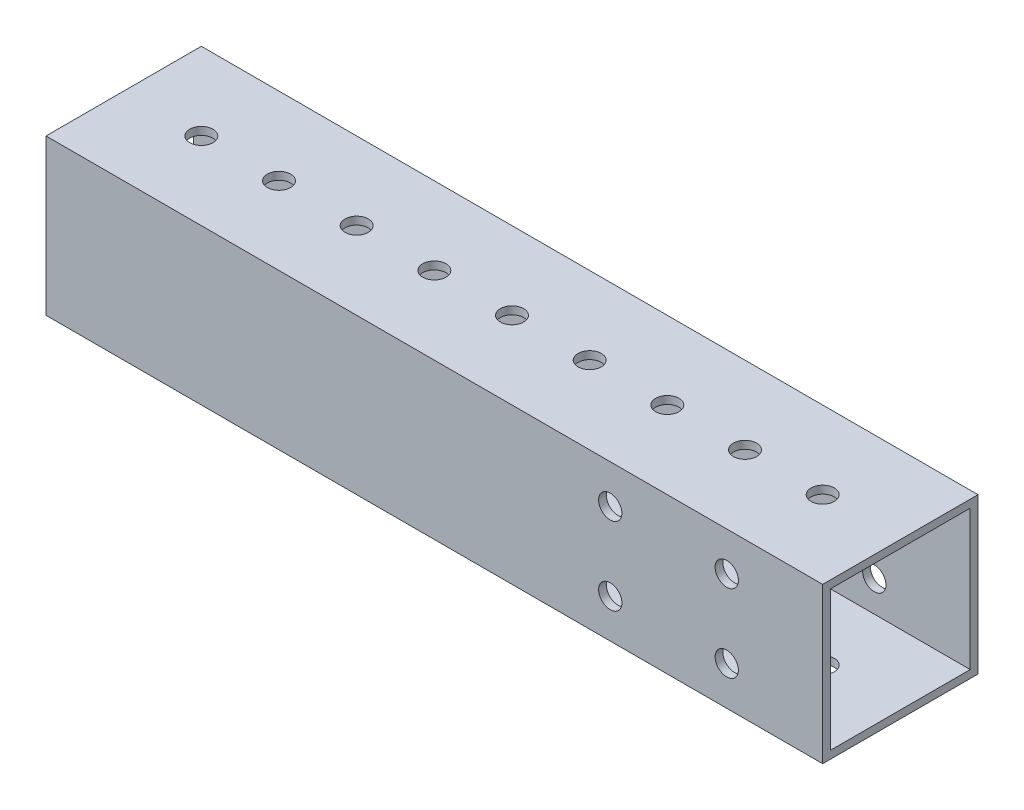
ISO-10303-21;
HEADER;
FILE_DESCRIPTION(('STEP AP214'),'2;1');
FILE_NAME('part.step','',(''),(''),'','','');
FILE_SCHEMA(('AUTOMOTIVE_DESIGN { 1 0 10303 214 1 1 1 1 }'));
ENDSEC;
DATA;
#1=APPLICATION_CONTEXT('core data for automotive mechanical design processes');
#2=APPLICATION_PROTOCOL_DEFINITION('international standard','automotive_design',2000,#1);
#3=PRODUCT_CONTEXT('',#1,'mechanical');
#4=PRODUCT('Part','Part','',(#3));
#5=PRODUCT_RELATED_PRODUCT_CATEGORY('part','',(#4));
#6=PRODUCT_DEFINITION_FORMATION('','',#4);
#7=PRODUCT_DEFINITION_CONTEXT('part definition',#1,'design');
#8=PRODUCT_DEFINITION('design','',#6,#7);
#9=PRODUCT_DEFINITION_SHAPE('','',#8);
#10=(LENGTH_UNIT() NAMED_UNIT(*) SI_UNIT(.MILLI.,.METRE.));
#11=(NAMED_UNIT(*) PLANE_ANGLE_UNIT() SI_UNIT($,.RADIAN.));
#12=(NAMED_UNIT(*) SI_UNIT($,.STERADIAN.) SOLID_ANGLE_UNIT());
#13=UNCERTAINTY_MEASURE_WITH_UNIT(LENGTH_MEASURE(1.E-05),#10,'distance_accuracy_value','');
#14=(GEOMETRIC_REPRESENTATION_CONTEXT(3) GLOBAL_UNCERTAINTY_ASSIGNED_CONTEXT((#13)) GLOBAL_UNIT_ASSIGNED_CONTEXT((#10,
#11,#12)) REPRESENTATION_CONTEXT('',''));
#15=CARTESIAN_POINT('',(0.,0.,0.));
#16=DIRECTION('',(0.,0.,1.));
#17=DIRECTION('',(1.,0.,0.));
#18=AXIS2_PLACEMENT_3D('',#15,#16,#17);
#19=CARTESIAN_POINT('',(100.,0.,0.));
#20=DIRECTION('',(1.,0.,0.));
#21=DIRECTION('',(0.,0.,-1.));
#22=AXIS2_PLACEMENT_3D('',#19,#20,#21);
#23=PLANE('',#22);
#24=DIRECTION('',(0.,1.,0.));
#25=VECTOR('',#24,1.);
#26=CARTESIAN_POINT('',(100.,0.,0.));
#27=LINE('',#26,#25);
#28=CARTESIAN_POINT('',(100.,0.,0.));
#29=VERTEX_POINT('',#28);
#30=CARTESIAN_POINT('',(100.,20.,0.));
#31=VERTEX_POINT('',#30);
#32=EDGE_CURVE('E149',#29,#31,#27,.T.);
#33=ORIENTED_EDGE('',*,*,#32,.T.);
#34=DIRECTION('',(0.,0.,1.));
#35=VECTOR('',#34,1.);
#36=CARTESIAN_POINT('',(100.,20.,0.));
#37=LINE('',#36,#35);
#38=CARTESIAN_POINT('',(100.,20.,20.));
#39=VERTEX_POINT('',#38);
#40=EDGE_CURVE('E151',#31,#39,#37,.T.);
#41=ORIENTED_EDGE('',*,*,#40,.T.);
#42=DIRECTION('',(0.,-1.,0.));
#43=VECTOR('',#42,1.);
#44=CARTESIAN_POINT('',(100.,0.,20.));
#45=LINE('',#44,#43);
#46=CARTESIAN_POINT('',(100.,0.,20.));
#47=VERTEX_POINT('',#46);
#48=EDGE_CURVE('E152',#39,#47,#45,.T.);
#49=ORIENTED_EDGE('',*,*,#48,.T.);
#50=DIRECTION('',(0.,0.,-1.));
#51=VECTOR('',#50,1.);
#52=CARTESIAN_POINT('',(100.,0.,0.));
#53=LINE('',#52,#51);
#54=EDGE_CURVE('E158',#47,#29,#53,.T.);
#55=ORIENTED_EDGE('',*,*,#54,.T.);
#56=EDGE_LOOP('',(#33,#41,#49,#55));
#57=FACE_BOUND('',#56,.T.);
#58=DIRECTION('',(0.,0.,1.));
#59=VECTOR('',#58,1.);
#60=CARTESIAN_POINT('',(100.,19.,1.));
#61=LINE('',#60,#59);
#62=CARTESIAN_POINT('',(100.,19.,1.));
#63=VERTEX_POINT('',#62);
#64=CARTESIAN_POINT('',(100.,19.,19.));
#65=VERTEX_POINT('',#64);
#66=EDGE_CURVE('E117',#63,#65,#61,.T.);
#67=ORIENTED_EDGE('',*,*,#66,.F.);
#68=DIRECTION('',(0.,1.,0.));
#69=VECTOR('',#68,1.);
#70=CARTESIAN_POINT('',(100.,1.,1.));
#71=LINE('',#70,#69);
#72=CARTESIAN_POINT('',(100.,1.,1.));
#73=VERTEX_POINT('',#72);
#74=EDGE_CURVE('E109',#73,#63,#71,.T.);
#75=ORIENTED_EDGE('',*,*,#74,.F.);
#76=DIRECTION('',(0.,0.,-1.));
#77=VECTOR('',#76,1.);
#78=CARTESIAN_POINT('',(100.,1.,1.));
#79=LINE('',#78,#77);
#80=CARTESIAN_POINT('',(100.,1.,19.));
#81=VERTEX_POINT('',#80);
#82=EDGE_CURVE('E135',#81,#73,#79,.T.);
#83=ORIENTED_EDGE('',*,*,#82,.F.);
#84=DIRECTION('',(0.,-1.,0.));
#85=VECTOR('',#84,1.);
#86=CARTESIAN_POINT('',(100.,1.,19.));
#87=LINE('',#86,#85);
#88=EDGE_CURVE('E128',#65,#81,#87,.T.);
#89=ORIENTED_EDGE('',*,*,#88,.F.);
#90=EDGE_LOOP('',(#67,#75,#83,#89));
#91=FACE_BOUND('',#90,.T.);
#92=ADVANCED_FACE('F43',(#57,#91),#23,.T.);
#93=CARTESIAN_POINT('',(0.,0.,0.));
#94=DIRECTION('',(1.,0.,0.));
#95=DIRECTION('',(0.,0.,-1.));
#96=AXIS2_PLACEMENT_3D('',#93,#94,#95);
#97=PLANE('',#96);
#98=DIRECTION('',(0.,1.,0.));
#99=VECTOR('',#98,1.);
#100=CARTESIAN_POINT('',(0.,0.,0.));
#101=LINE('',#100,#99);
#102=CARTESIAN_POINT('',(0.,0.,0.));
#103=VERTEX_POINT('',#102);
#104=CARTESIAN_POINT('',(0.,20.,0.));
#105=VERTEX_POINT('',#104);
#106=EDGE_CURVE('E127',#103,#105,#101,.T.);
#107=ORIENTED_EDGE('',*,*,#106,.F.);
#108=DIRECTION('',(0.,0.,-1.));
#109=VECTOR('',#108,1.);
#110=CARTESIAN_POINT('',(0.,0.,0.));
#111=LINE('',#110,#109);
#112=CARTESIAN_POINT('',(0.,0.,20.));
#113=VERTEX_POINT('',#112);
#114=EDGE_CURVE('E155',#113,#103,#111,.T.);
#115=ORIENTED_EDGE('',*,*,#114,.F.);
#116=DIRECTION('',(0.,-1.,0.));
#117=VECTOR('',#116,1.);
#118=CARTESIAN_POINT('',(0.,0.,20.));
#119=LINE('',#118,#117);
#120=CARTESIAN_POINT('',(0.,20.,20.));
#121=VERTEX_POINT('',#120);
#122=EDGE_CURVE('E161',#121,#113,#119,.T.);
#123=ORIENTED_EDGE('',*,*,#122,.F.);
#124=DIRECTION('',(0.,0.,1.));
#125=VECTOR('',#124,1.);
#126=CARTESIAN_POINT('',(0.,20.,0.));
#127=LINE('',#126,#125);
#128=EDGE_CURVE('E163',#105,#121,#127,.T.);
#129=ORIENTED_EDGE('',*,*,#128,.F.);
#130=EDGE_LOOP('',(#107,#115,#123,#129));
#131=FACE_BOUND('',#130,.T.);
#132=DIRECTION('',(0.,1.,0.));
#133=VECTOR('',#132,1.);
#134=CARTESIAN_POINT('',(0.,1.,1.));
#135=LINE('',#134,#133);
#136=CARTESIAN_POINT('',(0.,1.,1.));
#137=VERTEX_POINT('',#136);
#138=CARTESIAN_POINT('',(0.,19.,1.));
#139=VERTEX_POINT('',#138);
#140=EDGE_CURVE('E68',#137,#139,#135,.T.);
#141=ORIENTED_EDGE('',*,*,#140,.T.);
#142=DIRECTION('',(0.,0.,1.));
#143=VECTOR('',#142,1.);
#144=CARTESIAN_POINT('',(0.,19.,1.));
#145=LINE('',#144,#143);
#146=CARTESIAN_POINT('',(0.,19.,19.));
#147=VERTEX_POINT('',#146);
#148=EDGE_CURVE('E123',#139,#147,#145,.T.);
#149=ORIENTED_EDGE('',*,*,#148,.T.);
#150=DIRECTION('',(0.,-1.,0.));
#151=VECTOR('',#150,1.);
#152=CARTESIAN_POINT('',(0.,1.,19.));
#153=LINE('',#152,#151);
#154=CARTESIAN_POINT('',(0.,1.,19.));
#155=VERTEX_POINT('',#154);
#156=EDGE_CURVE('E137',#147,#155,#153,.T.);
#157=ORIENTED_EDGE('',*,*,#156,.T.);
#158=DIRECTION('',(0.,0.,-1.));
#159=VECTOR('',#158,1.);
#160=CARTESIAN_POINT('',(0.,1.,1.));
#161=LINE('',#160,#159);
#162=EDGE_CURVE('E118',#155,#137,#161,.T.);
#163=ORIENTED_EDGE('',*,*,#162,.T.);
#164=EDGE_LOOP('',(#141,#149,#157,#163));
#165=FACE_BOUND('',#164,.T.);
#166=ADVANCED_FACE('F287',(#131,#165),#97,.F.);
#167=CARTESIAN_POINT('',(100.,0.,0.));
#168=DIRECTION('',(0.,0.,1.));
#169=DIRECTION('',(1.,0.,0.));
#170=AXIS2_PLACEMENT_3D('',#167,#168,#169);
#171=PLANE('',#170);
#172=CARTESIAN_POINT('',(72.65,5.,0.));
#173=DIRECTION('',(0.,0.,1.));
#174=DIRECTION('',(-1.,0.,0.));
#175=AXIS2_PLACEMENT_3D('',#172,#173,#174);
#176=CIRCLE('',#175,1.49999999999995);
#177=CARTESIAN_POINT('',(71.15,5.,0.));
#178=VERTEX_POINT('',#177);
#179=EDGE_CURVE('E244',#178,#178,#176,.T.);
#180=ORIENTED_EDGE('',*,*,#179,.T.);
#181=EDGE_LOOP('',(#180));
#182=FACE_BOUND('',#181,.T.);
#183=CARTESIAN_POINT('',(87.65,15.,0.));
#184=DIRECTION('',(0.,0.,1.));
#185=DIRECTION('',(1.,0.,0.));
#186=AXIS2_PLACEMENT_3D('',#183,#184,#185);
#187=CIRCLE('',#186,1.49999999999998);
#188=CARTESIAN_POINT('',(89.15,15.,0.));
#189=VERTEX_POINT('',#188);
#190=EDGE_CURVE('E238',#189,#189,#187,.T.);
#191=ORIENTED_EDGE('',*,*,#190,.T.);
#192=EDGE_LOOP('',(#191));
#193=FACE_BOUND('',#192,.T.);
#194=CARTESIAN_POINT('',(87.65,5.,0.));
#195=DIRECTION('',(0.,0.,1.));
#196=DIRECTION('',(-1.,0.,0.));
#197=AXIS2_PLACEMENT_3D('',#194,#195,#196);
#198=CIRCLE('',#197,1.49999999999995);
#199=CARTESIAN_POINT('',(86.15,5.,0.));
#200=VERTEX_POINT('',#199);
#201=EDGE_CURVE('E234',#200,#200,#198,.T.);
#202=ORIENTED_EDGE('',*,*,#201,.T.);
#203=EDGE_LOOP('',(#202));
#204=FACE_BOUND('',#203,.T.);
#205=CARTESIAN_POINT('',(72.65,15.,0.));
#206=DIRECTION('',(0.,0.,1.));
#207=DIRECTION('',(1.,0.,0.));
#208=AXIS2_PLACEMENT_3D('',#205,#206,#207);
#209=CIRCLE('',#208,1.49999999999998);
#210=CARTESIAN_POINT('',(74.15,15.,0.));
#211=VERTEX_POINT('',#210);
#212=EDGE_CURVE('E180',#211,#211,#209,.T.);
#213=ORIENTED_EDGE('',*,*,#212,.T.);
#214=EDGE_LOOP('',(#213));
#215=FACE_BOUND('',#214,.T.);
#216=ORIENTED_EDGE('',*,*,#106,.T.);
#217=DIRECTION('',(-1.,0.,0.));
#218=VECTOR('',#217,1.);
#219=CARTESIAN_POINT('',(100.,20.,0.));
#220=LINE('',#219,#218);
#221=EDGE_CURVE('E11',#31,#105,#220,.T.);
#222=ORIENTED_EDGE('',*,*,#221,.F.);
#223=ORIENTED_EDGE('',*,*,#32,.F.);
#224=DIRECTION('',(-1.,0.,0.));
#225=VECTOR('',#224,1.);
#226=CARTESIAN_POINT('',(100.,0.,0.));
#227=LINE('',#226,#225);
#228=EDGE_CURVE('E156',#29,#103,#227,.T.);
#229=ORIENTED_EDGE('',*,*,#228,.T.);
#230=EDGE_LOOP('',(#216,#222,#223,#229));
#231=FACE_BOUND('',#230,.T.);
#232=ADVANCED_FACE('F44',(#182,#193,#204,#215,#231),#171,.F.);
#233=CARTESIAN_POINT('',(100.,20.,0.));
#234=DIRECTION('',(0.,-1.,0.));
#235=DIRECTION('',(0.,0.,-1.));
#236=AXIS2_PLACEMENT_3D('',#233,#234,#235);
#237=PLANE('',#236);
#238=CARTESIAN_POINT('',(90.,20.,10.));
#239=DIRECTION('',(0.,1.,0.));
#240=DIRECTION('',(0.,0.,1.));
#241=AXIS2_PLACEMENT_3D('',#238,#239,#240);
#242=CIRCLE('',#241,1.5);
#243=CARTESIAN_POINT('',(90.,20.,11.5));
#244=VERTEX_POINT('',#243);
#245=EDGE_CURVE('E408',#244,#244,#242,.T.);
#246=ORIENTED_EDGE('',*,*,#245,.F.);
#247=EDGE_LOOP('',(#246));
#248=FACE_BOUND('',#247,.T.);
#249=CARTESIAN_POINT('',(80.,20.,10.));
#250=DIRECTION('',(0.,1.,0.));
#251=DIRECTION('',(0.,0.,1.));
#252=AXIS2_PLACEMENT_3D('',#249,#250,#251);
#253=CIRCLE('',#252,1.5);
#254=CARTESIAN_POINT('',(80.,20.,11.5));
#255=VERTEX_POINT('',#254);
#256=EDGE_CURVE('E411',#255,#255,#253,.T.);
#257=ORIENTED_EDGE('',*,*,#256,.F.);
#258=EDGE_LOOP('',(#257));
#259=FACE_BOUND('',#258,.T.);
#260=CARTESIAN_POINT('',(70.,20.,10.));
#261=DIRECTION('',(0.,1.,0.));
#262=DIRECTION('',(0.,0.,1.));
#263=AXIS2_PLACEMENT_3D('',#260,#261,#262);
#264=CIRCLE('',#263,1.5);
#265=CARTESIAN_POINT('',(70.,20.,11.5));
#266=VERTEX_POINT('',#265);
#267=EDGE_CURVE('E423',#266,#266,#264,.T.);
#268=ORIENTED_EDGE('',*,*,#267,.F.);
#269=EDGE_LOOP('',(#268));
#270=FACE_BOUND('',#269,.T.);
#271=CARTESIAN_POINT('',(60.,20.,10.));
#272=DIRECTION('',(0.,1.,0.));
#273=DIRECTION('',(0.,0.,1.));
#274=AXIS2_PLACEMENT_3D('',#271,#272,#273);
#275=CIRCLE('',#274,1.5);
#276=CARTESIAN_POINT('',(60.,20.,11.5));
#277=VERTEX_POINT('',#276);
#278=EDGE_CURVE('E430',#277,#277,#275,.T.);
#279=ORIENTED_EDGE('',*,*,#278,.F.);
#280=EDGE_LOOP('',(#279));
#281=FACE_BOUND('',#280,.T.);
#282=CARTESIAN_POINT('',(50.,20.,10.));
#283=DIRECTION('',(0.,1.,0.));
#284=DIRECTION('',(0.,0.,1.));
#285=AXIS2_PLACEMENT_3D('',#282,#283,#284);
#286=CIRCLE('',#285,1.5);
#287=CARTESIAN_POINT('',(50.,20.,11.5));
#288=VERTEX_POINT('',#287);
#289=EDGE_CURVE('E433',#288,#288,#286,.T.);
#290=ORIENTED_EDGE('',*,*,#289,.F.);
#291=EDGE_LOOP('',(#290));
#292=FACE_BOUND('',#291,.T.);
#293=CARTESIAN_POINT('',(40.,20.,10.));
#294=DIRECTION('',(0.,1.,0.));
#295=DIRECTION('',(0.,0.,1.));
#296=AXIS2_PLACEMENT_3D('',#293,#294,#295);
#297=CIRCLE('',#296,1.5);
#298=CARTESIAN_POINT('',(40.,20.,11.5));
#299=VERTEX_POINT('',#298);
#300=EDGE_CURVE('E437',#299,#299,#297,.T.);
#301=ORIENTED_EDGE('',*,*,#300,.F.);
#302=EDGE_LOOP('',(#301));
#303=FACE_BOUND('',#302,.T.);
#304=CARTESIAN_POINT('',(30.,20.,10.));
#305=DIRECTION('',(0.,1.,0.));
#306=DIRECTION('',(0.,0.,1.));
#307=AXIS2_PLACEMENT_3D('',#304,#305,#306);
#308=CIRCLE('',#307,1.5);
#309=CARTESIAN_POINT('',(30.,20.,11.5));
#310=VERTEX_POINT('',#309);
#311=EDGE_CURVE('E444',#310,#310,#308,.T.);
#312=ORIENTED_EDGE('',*,*,#311,.F.);
#313=EDGE_LOOP('',(#312));
#314=FACE_BOUND('',#313,.T.);
#315=CARTESIAN_POINT('',(20.,20.,10.));
#316=DIRECTION('',(0.,1.,0.));
#317=DIRECTION('',(0.,0.,1.));
#318=AXIS2_PLACEMENT_3D('',#315,#316,#317);
#319=CIRCLE('',#318,1.5);
#320=CARTESIAN_POINT('',(20.,20.,11.5));
#321=VERTEX_POINT('',#320);
#322=EDGE_CURVE('E452',#321,#321,#319,.T.);
#323=ORIENTED_EDGE('',*,*,#322,.F.);
#324=EDGE_LOOP('',(#323));
#325=FACE_BOUND('',#324,.T.);
#326=CARTESIAN_POINT('',(10.,20.,10.));
#327=DIRECTION('',(0.,1.,0.));
#328=DIRECTION('',(0.,0.,1.));
#329=AXIS2_PLACEMENT_3D('',#326,#327,#328);
#330=CIRCLE('',#329,1.5);
#331=CARTESIAN_POINT('',(10.,20.,11.5));
#332=VERTEX_POINT('',#331);
#333=EDGE_CURVE('E460',#332,#332,#330,.T.);
#334=ORIENTED_EDGE('',*,*,#333,.F.);
#335=EDGE_LOOP('',(#334));
#336=FACE_BOUND('',#335,.T.);
#337=ORIENTED_EDGE('',*,*,#128,.T.);
#338=DIRECTION('',(-1.,0.,0.));
#339=VECTOR('',#338,1.);
#340=CARTESIAN_POINT('',(100.,20.,20.));
#341=LINE('',#340,#339);
#342=EDGE_CURVE('E55',#39,#121,#341,.T.);
#343=ORIENTED_EDGE('',*,*,#342,.F.);
#344=ORIENTED_EDGE('',*,*,#40,.F.);
#345=ORIENTED_EDGE('',*,*,#221,.T.);
#346=EDGE_LOOP('',(#337,#343,#344,#345));
#347=FACE_BOUND('',#346,.T.);
#348=ADVANCED_FACE('F289',(#248,#259,#270,#281,#292,#303,#314,#325,#336,#347),#237,.F.);
#349=CARTESIAN_POINT('',(100.,0.,20.));
#350=DIRECTION('',(0.,0.,-1.));
#351=DIRECTION('',(-1.,0.,0.));
#352=AXIS2_PLACEMENT_3D('',#349,#350,#351);
#353=PLANE('',#352);
#354=CARTESIAN_POINT('',(72.65,5.,20.));
#355=DIRECTION('',(0.,0.,1.));
#356=DIRECTION('',(-1.,0.,0.));
#357=AXIS2_PLACEMENT_3D('',#354,#355,#356);
#358=CIRCLE('',#357,1.49999999999995);
#359=CARTESIAN_POINT('',(71.15,5.,20.));
#360=VERTEX_POINT('',#359);
#361=EDGE_CURVE('E241',#360,#360,#358,.T.);
#362=ORIENTED_EDGE('',*,*,#361,.F.);
#363=EDGE_LOOP('',(#362));
#364=FACE_BOUND('',#363,.T.);
#365=CARTESIAN_POINT('',(87.65,15.,20.));
#366=DIRECTION('',(0.,0.,1.));
#367=DIRECTION('',(1.,0.,0.));
#368=AXIS2_PLACEMENT_3D('',#365,#366,#367);
#369=CIRCLE('',#368,1.49999999999998);
#370=CARTESIAN_POINT('',(89.15,15.,20.));
#371=VERTEX_POINT('',#370);
#372=EDGE_CURVE('E247',#371,#371,#369,.T.);
#373=ORIENTED_EDGE('',*,*,#372,.F.);
#374=EDGE_LOOP('',(#373));
#375=FACE_BOUND('',#374,.T.);
#376=CARTESIAN_POINT('',(87.65,5.,20.));
#377=DIRECTION('',(0.,0.,1.));
#378=DIRECTION('',(-1.,0.,0.));
#379=AXIS2_PLACEMENT_3D('',#376,#377,#378);
#380=CIRCLE('',#379,1.49999999999995);
#381=CARTESIAN_POINT('',(86.15,5.,20.));
#382=VERTEX_POINT('',#381);
#383=EDGE_CURVE('E232',#382,#382,#380,.T.);
#384=ORIENTED_EDGE('',*,*,#383,.F.);
#385=EDGE_LOOP('',(#384));
#386=FACE_BOUND('',#385,.T.);
#387=CARTESIAN_POINT('',(72.65,15.,20.));
#388=DIRECTION('',(0.,0.,1.));
#389=DIRECTION('',(1.,0.,0.));
#390=AXIS2_PLACEMENT_3D('',#387,#388,#389);
#391=CIRCLE('',#390,1.49999999999998);
#392=CARTESIAN_POINT('',(74.15,15.,20.));
#393=VERTEX_POINT('',#392);
#394=EDGE_CURVE('E242',#393,#393,#391,.T.);
#395=ORIENTED_EDGE('',*,*,#394,.F.);
#396=EDGE_LOOP('',(#395));
#397=FACE_BOUND('',#396,.T.);
#398=ORIENTED_EDGE('',*,*,#122,.T.);
#399=DIRECTION('',(-1.,0.,0.));
#400=VECTOR('',#399,1.);
#401=CARTESIAN_POINT('',(100.,0.,20.));
#402=LINE('',#401,#400);
#403=EDGE_CURVE('E166',#47,#113,#402,.T.);
#404=ORIENTED_EDGE('',*,*,#403,.F.);
#405=ORIENTED_EDGE('',*,*,#48,.F.);
#406=ORIENTED_EDGE('',*,*,#342,.T.);
#407=EDGE_LOOP('',(#398,#404,#405,#406));
#408=FACE_BOUND('',#407,.T.);
#409=ADVANCED_FACE('F308',(#364,#375,#386,#397,#408),#353,.F.);
#410=CARTESIAN_POINT('',(100.,0.,0.));
#411=DIRECTION('',(0.,1.,0.));
#412=DIRECTION('',(0.,0.,1.));
#413=AXIS2_PLACEMENT_3D('',#410,#411,#412);
#414=PLANE('',#413);
#415=CARTESIAN_POINT('',(90.,0.,10.));
#416=DIRECTION('',(0.,1.,0.));
#417=DIRECTION('',(0.,0.,1.));
#418=AXIS2_PLACEMENT_3D('',#415,#416,#417);
#419=CIRCLE('',#418,1.5);
#420=CARTESIAN_POINT('',(90.,0.,11.5));
#421=VERTEX_POINT('',#420);
#422=EDGE_CURVE('E194',#421,#421,#419,.T.);
#423=ORIENTED_EDGE('',*,*,#422,.T.);
#424=EDGE_LOOP('',(#423));
#425=FACE_BOUND('',#424,.T.);
#426=CARTESIAN_POINT('',(80.,0.,10.));
#427=DIRECTION('',(0.,1.,0.));
#428=DIRECTION('',(0.,0.,1.));
#429=AXIS2_PLACEMENT_3D('',#426,#427,#428);
#430=CIRCLE('',#429,1.5);
#431=CARTESIAN_POINT('',(80.,0.,11.5));
#432=VERTEX_POINT('',#431);
#433=EDGE_CURVE('E418',#432,#432,#430,.T.);
#434=ORIENTED_EDGE('',*,*,#433,.T.);
#435=EDGE_LOOP('',(#434));
#436=FACE_BOUND('',#435,.T.);
#437=CARTESIAN_POINT('',(70.,0.,10.));
#438=DIRECTION('',(0.,1.,0.));
#439=DIRECTION('',(0.,0.,1.));
#440=AXIS2_PLACEMENT_3D('',#437,#438,#439);
#441=CIRCLE('',#440,1.5);
#442=CARTESIAN_POINT('',(70.,0.,11.5));
#443=VERTEX_POINT('',#442);
#444=EDGE_CURVE('E425',#443,#443,#441,.T.);
#445=ORIENTED_EDGE('',*,*,#444,.T.);
#446=EDGE_LOOP('',(#445));
#447=FACE_BOUND('',#446,.T.);
#448=CARTESIAN_POINT('',(60.,0.,10.));
#449=DIRECTION('',(0.,1.,0.));
#450=DIRECTION('',(0.,0.,1.));
#451=AXIS2_PLACEMENT_3D('',#448,#449,#450);
#452=CIRCLE('',#451,1.5);
#453=CARTESIAN_POINT('',(60.,0.,11.5));
#454=VERTEX_POINT('',#453);
#455=EDGE_CURVE('E427',#454,#454,#452,.T.);
#456=ORIENTED_EDGE('',*,*,#455,.T.);
#457=EDGE_LOOP('',(#456));
#458=FACE_BOUND('',#457,.T.);
#459=CARTESIAN_POINT('',(50.,0.,10.));
#460=DIRECTION('',(0.,1.,0.));
#461=DIRECTION('',(0.,0.,1.));
#462=AXIS2_PLACEMENT_3D('',#459,#460,#461);
#463=CIRCLE('',#462,1.5);
#464=CARTESIAN_POINT('',(50.,0.,11.5));
#465=VERTEX_POINT('',#464);
#466=EDGE_CURVE('E436',#465,#465,#463,.T.);
#467=ORIENTED_EDGE('',*,*,#466,.T.);
#468=EDGE_LOOP('',(#467));
#469=FACE_BOUND('',#468,.T.);
#470=CARTESIAN_POINT('',(40.,0.,10.));
#471=DIRECTION('',(0.,1.,0.));
#472=DIRECTION('',(0.,0.,1.));
#473=AXIS2_PLACEMENT_3D('',#470,#471,#472);
#474=CIRCLE('',#473,1.5);
#475=CARTESIAN_POINT('',(40.,0.,11.5));
#476=VERTEX_POINT('',#475);
#477=EDGE_CURVE('E445',#476,#476,#474,.T.);
#478=ORIENTED_EDGE('',*,*,#477,.T.);
#479=EDGE_LOOP('',(#478));
#480=FACE_BOUND('',#479,.T.);
#481=CARTESIAN_POINT('',(30.,0.,10.));
#482=DIRECTION('',(0.,1.,0.));
#483=DIRECTION('',(0.,0.,1.));
#484=AXIS2_PLACEMENT_3D('',#481,#482,#483);
#485=CIRCLE('',#484,1.5);
#486=CARTESIAN_POINT('',(30.,0.,11.5));
#487=VERTEX_POINT('',#486);
#488=EDGE_CURVE('E449',#487,#487,#485,.T.);
#489=ORIENTED_EDGE('',*,*,#488,.T.);
#490=EDGE_LOOP('',(#489));
#491=FACE_BOUND('',#490,.T.);
#492=CARTESIAN_POINT('',(20.,0.,10.));
#493=DIRECTION('',(0.,1.,0.));
#494=DIRECTION('',(0.,0.,1.));
#495=AXIS2_PLACEMENT_3D('',#492,#493,#494);
#496=CIRCLE('',#495,1.5);
#497=CARTESIAN_POINT('',(20.,0.,11.5));
#498=VERTEX_POINT('',#497);
#499=EDGE_CURVE('E451',#498,#498,#496,.T.);
#500=ORIENTED_EDGE('',*,*,#499,.T.);
#501=EDGE_LOOP('',(#500));
#502=FACE_BOUND('',#501,.T.);
#503=CARTESIAN_POINT('',(10.,0.,10.));
#504=DIRECTION('',(0.,1.,0.));
#505=DIRECTION('',(0.,0.,1.));
#506=AXIS2_PLACEMENT_3D('',#503,#504,#505);
#507=CIRCLE('',#506,1.5);
#508=CARTESIAN_POINT('',(10.,0.,11.5));
#509=VERTEX_POINT('',#508);
#510=EDGE_CURVE('E459',#509,#509,#507,.T.);
#511=ORIENTED_EDGE('',*,*,#510,.T.);
#512=EDGE_LOOP('',(#511));
#513=FACE_BOUND('',#512,.T.);
#514=ORIENTED_EDGE('',*,*,#114,.T.);
#515=ORIENTED_EDGE('',*,*,#228,.F.);
#516=ORIENTED_EDGE('',*,*,#54,.F.);
#517=ORIENTED_EDGE('',*,*,#403,.T.);
#518=EDGE_LOOP('',(#514,#515,#516,#517));
#519=FACE_BOUND('',#518,.T.);
#520=ADVANCED_FACE('F267',(#425,#436,#447,#458,#469,#480,#491,#502,#513,#519),#414,.F.);
#521=CARTESIAN_POINT('',(100.,1.,1.));
#522=DIRECTION('',(0.,0.,1.));
#523=DIRECTION('',(1.,0.,0.));
#524=AXIS2_PLACEMENT_3D('',#521,#522,#523);
#525=PLANE('',#524);
#526=CARTESIAN_POINT('',(72.65,5.,1.));
#527=DIRECTION('',(0.,0.,1.));
#528=DIRECTION('',(1.,0.,0.));
#529=AXIS2_PLACEMENT_3D('',#526,#527,#528);
#530=CIRCLE('',#529,1.49999999999995);
#531=CARTESIAN_POINT('',(74.1499999999999,5.,1.));
#532=VERTEX_POINT('',#531);
#533=EDGE_CURVE('E136',#532,#532,#530,.T.);
#534=ORIENTED_EDGE('',*,*,#533,.F.);
#535=EDGE_LOOP('',(#534));
#536=FACE_BOUND('',#535,.T.);
#537=CARTESIAN_POINT('',(87.65,15.,1.));
#538=DIRECTION('',(0.,0.,1.));
#539=DIRECTION('',(1.,0.,0.));
#540=AXIS2_PLACEMENT_3D('',#537,#538,#539);
#541=CIRCLE('',#540,1.49999999999998);
#542=CARTESIAN_POINT('',(89.15,15.,1.));
#543=VERTEX_POINT('',#542);
#544=EDGE_CURVE('E184',#543,#543,#541,.T.);
#545=ORIENTED_EDGE('',*,*,#544,.F.);
#546=EDGE_LOOP('',(#545));
#547=FACE_BOUND('',#546,.T.);
#548=CARTESIAN_POINT('',(87.65,5.,1.));
#549=DIRECTION('',(0.,0.,1.));
#550=DIRECTION('',(1.,0.,0.));
#551=AXIS2_PLACEMENT_3D('',#548,#549,#550);
#552=CIRCLE('',#551,1.49999999999995);
#553=CARTESIAN_POINT('',(89.1499999999999,5.,1.));
#554=VERTEX_POINT('',#553);
#555=EDGE_CURVE('E181',#554,#554,#552,.T.);
#556=ORIENTED_EDGE('',*,*,#555,.F.);
#557=EDGE_LOOP('',(#556));
#558=FACE_BOUND('',#557,.T.);
#559=CARTESIAN_POINT('',(72.65,15.,1.));
#560=DIRECTION('',(0.,0.,1.));
#561=DIRECTION('',(1.,0.,0.));
#562=AXIS2_PLACEMENT_3D('',#559,#560,#561);
#563=CIRCLE('',#562,1.49999999999998);
#564=CARTESIAN_POINT('',(74.15,15.,1.));
#565=VERTEX_POINT('',#564);
#566=EDGE_CURVE('E176',#565,#565,#563,.T.);
#567=ORIENTED_EDGE('',*,*,#566,.F.);
#568=EDGE_LOOP('',(#567));
#569=FACE_BOUND('',#568,.T.);
#570=ORIENTED_EDGE('',*,*,#140,.F.);
#571=DIRECTION('',(-1.,0.,0.));
#572=VECTOR('',#571,1.);
#573=CARTESIAN_POINT('',(100.,1.,1.));
#574=LINE('',#573,#572);
#575=EDGE_CURVE('E112',#73,#137,#574,.T.);
#576=ORIENTED_EDGE('',*,*,#575,.F.);
#577=ORIENTED_EDGE('',*,*,#74,.T.);
#578=DIRECTION('',(-1.,0.,0.));
#579=VECTOR('',#578,1.);
#580=CARTESIAN_POINT('',(100.,19.,1.));
#581=LINE('',#580,#579);
#582=EDGE_CURVE('E113',#63,#139,#581,.T.);
#583=ORIENTED_EDGE('',*,*,#582,.T.);
#584=EDGE_LOOP('',(#570,#576,#577,#583));
#585=FACE_BOUND('',#584,.T.);
#586=ADVANCED_FACE('F115',(#536,#547,#558,#569,#585),#525,.T.);
#587=CARTESIAN_POINT('',(100.,19.,1.));
#588=DIRECTION('',(0.,-1.,0.));
#589=DIRECTION('',(0.,0.,-1.));
#590=AXIS2_PLACEMENT_3D('',#587,#588,#589);
#591=PLANE('',#590);
#592=CARTESIAN_POINT('',(90.,19.,10.));
#593=DIRECTION('',(0.,-1.,0.));
#594=DIRECTION('',(0.,0.,-1.));
#595=AXIS2_PLACEMENT_3D('',#592,#593,#594);
#596=CIRCLE('',#595,1.5);
#597=CARTESIAN_POINT('',(90.,19.,8.5));
#598=VERTEX_POINT('',#597);
#599=EDGE_CURVE('E233',#598,#598,#596,.T.);
#600=ORIENTED_EDGE('',*,*,#599,.F.);
#601=EDGE_LOOP('',(#600));
#602=FACE_BOUND('',#601,.T.);
#603=CARTESIAN_POINT('',(80.,19.,10.));
#604=DIRECTION('',(0.,-1.,0.));
#605=DIRECTION('',(0.,0.,-1.));
#606=AXIS2_PLACEMENT_3D('',#603,#604,#605);
#607=CIRCLE('',#606,1.5);
#608=CARTESIAN_POINT('',(80.,19.,8.50000000000001));
#609=VERTEX_POINT('',#608);
#610=EDGE_CURVE('E217',#609,#609,#607,.T.);
#611=ORIENTED_EDGE('',*,*,#610,.F.);
#612=EDGE_LOOP('',(#611));
#613=FACE_BOUND('',#612,.T.);
#614=CARTESIAN_POINT('',(70.,19.,10.));
#615=DIRECTION('',(0.,-1.,0.));
#616=DIRECTION('',(0.,0.,-1.));
#617=AXIS2_PLACEMENT_3D('',#614,#615,#616);
#618=CIRCLE('',#617,1.5);
#619=CARTESIAN_POINT('',(70.,19.,8.50000000000001));
#620=VERTEX_POINT('',#619);
#621=EDGE_CURVE('E216',#620,#620,#618,.T.);
#622=ORIENTED_EDGE('',*,*,#621,.F.);
#623=EDGE_LOOP('',(#622));
#624=FACE_BOUND('',#623,.T.);
#625=CARTESIAN_POINT('',(60.,19.,10.));
#626=DIRECTION('',(0.,-1.,0.));
#627=DIRECTION('',(0.,0.,-1.));
#628=AXIS2_PLACEMENT_3D('',#625,#626,#627);
#629=CIRCLE('',#628,1.5);
#630=CARTESIAN_POINT('',(60.,19.,8.50000000000001));
#631=VERTEX_POINT('',#630);
#632=EDGE_CURVE('E214',#631,#631,#629,.T.);
#633=ORIENTED_EDGE('',*,*,#632,.F.);
#634=EDGE_LOOP('',(#633));
#635=FACE_BOUND('',#634,.T.);
#636=CARTESIAN_POINT('',(50.,19.,10.));
#637=DIRECTION('',(0.,-1.,0.));
#638=DIRECTION('',(0.,0.,-1.));
#639=AXIS2_PLACEMENT_3D('',#636,#637,#638);
#640=CIRCLE('',#639,1.5);
#641=CARTESIAN_POINT('',(50.,19.,8.50000000000001));
#642=VERTEX_POINT('',#641);
#643=EDGE_CURVE('E209',#642,#642,#640,.T.);
#644=ORIENTED_EDGE('',*,*,#643,.F.);
#645=EDGE_LOOP('',(#644));
#646=FACE_BOUND('',#645,.T.);
#647=CARTESIAN_POINT('',(40.,19.,10.));
#648=DIRECTION('',(0.,-1.,0.));
#649=DIRECTION('',(0.,0.,-1.));
#650=AXIS2_PLACEMENT_3D('',#647,#648,#649);
#651=CIRCLE('',#650,1.5);
#652=CARTESIAN_POINT('',(40.,19.,8.50000000000001));
#653=VERTEX_POINT('',#652);
#654=EDGE_CURVE('E202',#653,#653,#651,.T.);
#655=ORIENTED_EDGE('',*,*,#654,.F.);
#656=EDGE_LOOP('',(#655));
#657=FACE_BOUND('',#656,.T.);
#658=CARTESIAN_POINT('',(30.,19.,10.));
#659=DIRECTION('',(0.,-1.,0.));
#660=DIRECTION('',(0.,0.,-1.));
#661=AXIS2_PLACEMENT_3D('',#658,#659,#660);
#662=CIRCLE('',#661,1.5);
#663=CARTESIAN_POINT('',(30.,19.,8.50000000000001));
#664=VERTEX_POINT('',#663);
#665=EDGE_CURVE('E203',#664,#664,#662,.T.);
#666=ORIENTED_EDGE('',*,*,#665,.F.);
#667=EDGE_LOOP('',(#666));
#668=FACE_BOUND('',#667,.T.);
#669=CARTESIAN_POINT('',(20.,19.,10.));
#670=DIRECTION('',(0.,-1.,0.));
#671=DIRECTION('',(0.,0.,-1.));
#672=AXIS2_PLACEMENT_3D('',#669,#670,#671);
#673=CIRCLE('',#672,1.5);
#674=CARTESIAN_POINT('',(20.,19.,8.50000000000001));
#675=VERTEX_POINT('',#674);
#676=EDGE_CURVE('E200',#675,#675,#673,.T.);
#677=ORIENTED_EDGE('',*,*,#676,.F.);
#678=EDGE_LOOP('',(#677));
#679=FACE_BOUND('',#678,.T.);
#680=CARTESIAN_POINT('',(10.,19.,10.));
#681=DIRECTION('',(0.,-1.,0.));
#682=DIRECTION('',(0.,0.,-1.));
#683=AXIS2_PLACEMENT_3D('',#680,#681,#682);
#684=CIRCLE('',#683,1.5);
#685=CARTESIAN_POINT('',(10.,19.,8.50000000000001));
#686=VERTEX_POINT('',#685);
#687=EDGE_CURVE('E195',#686,#686,#684,.T.);
#688=ORIENTED_EDGE('',*,*,#687,.F.);
#689=EDGE_LOOP('',(#688));
#690=FACE_BOUND('',#689,.T.);
#691=ORIENTED_EDGE('',*,*,#148,.F.);
#692=ORIENTED_EDGE('',*,*,#582,.F.);
#693=ORIENTED_EDGE('',*,*,#66,.T.);
#694=DIRECTION('',(-1.,0.,0.));
#695=VECTOR('',#694,1.);
#696=CARTESIAN_POINT('',(100.,19.,19.));
#697=LINE('',#696,#695);
#698=EDGE_CURVE('E130',#65,#147,#697,.T.);
#699=ORIENTED_EDGE('',*,*,#698,.T.);
#700=EDGE_LOOP('',(#691,#692,#693,#699));
#701=FACE_BOUND('',#700,.T.);
#702=ADVANCED_FACE('F125',(#602,#613,#624,#635,#646,#657,#668,#679,#690,#701),#591,.T.);
#703=CARTESIAN_POINT('',(100.,1.,19.));
#704=DIRECTION('',(0.,0.,-1.));
#705=DIRECTION('',(-1.,0.,0.));
#706=AXIS2_PLACEMENT_3D('',#703,#704,#705);
#707=PLANE('',#706);
#708=CARTESIAN_POINT('',(72.65,5.,19.));
#709=DIRECTION('',(0.,0.,-1.));
#710=DIRECTION('',(-1.,0.,0.));
#711=AXIS2_PLACEMENT_3D('',#708,#709,#710);
#712=CIRCLE('',#711,1.49999999999995);
#713=CARTESIAN_POINT('',(71.15,5.,19.));
#714=VERTEX_POINT('',#713);
#715=EDGE_CURVE('E187',#714,#714,#712,.T.);
#716=ORIENTED_EDGE('',*,*,#715,.F.);
#717=EDGE_LOOP('',(#716));
#718=FACE_BOUND('',#717,.T.);
#719=CARTESIAN_POINT('',(87.65,15.,19.));
#720=DIRECTION('',(0.,0.,-1.));
#721=DIRECTION('',(-1.,0.,0.));
#722=AXIS2_PLACEMENT_3D('',#719,#720,#721);
#723=CIRCLE('',#722,1.49999999999998);
#724=CARTESIAN_POINT('',(86.15,15.,19.));
#725=VERTEX_POINT('',#724);
#726=EDGE_CURVE('E185',#725,#725,#723,.T.);
#727=ORIENTED_EDGE('',*,*,#726,.F.);
#728=EDGE_LOOP('',(#727));
#729=FACE_BOUND('',#728,.T.);
#730=CARTESIAN_POINT('',(87.65,5.,19.));
#731=DIRECTION('',(0.,0.,-1.));
#732=DIRECTION('',(-1.,0.,0.));
#733=AXIS2_PLACEMENT_3D('',#730,#731,#732);
#734=CIRCLE('',#733,1.49999999999995);
#735=CARTESIAN_POINT('',(86.15,5.,19.));
#736=VERTEX_POINT('',#735);
#737=EDGE_CURVE('E178',#736,#736,#734,.T.);
#738=ORIENTED_EDGE('',*,*,#737,.F.);
#739=EDGE_LOOP('',(#738));
#740=FACE_BOUND('',#739,.T.);
#741=CARTESIAN_POINT('',(72.65,15.,19.));
#742=DIRECTION('',(0.,0.,-1.));
#743=DIRECTION('',(-1.,0.,0.));
#744=AXIS2_PLACEMENT_3D('',#741,#742,#743);
#745=CIRCLE('',#744,1.49999999999998);
#746=CARTESIAN_POINT('',(71.15,15.,19.));
#747=VERTEX_POINT('',#746);
#748=EDGE_CURVE('E173',#747,#747,#745,.T.);
#749=ORIENTED_EDGE('',*,*,#748,.F.);
#750=EDGE_LOOP('',(#749));
#751=FACE_BOUND('',#750,.T.);
#752=ORIENTED_EDGE('',*,*,#156,.F.);
#753=ORIENTED_EDGE('',*,*,#698,.F.);
#754=ORIENTED_EDGE('',*,*,#88,.T.);
#755=DIRECTION('',(-1.,0.,0.));
#756=VECTOR('',#755,1.);
#757=CARTESIAN_POINT('',(100.,1.,19.));
#758=LINE('',#757,#756);
#759=EDGE_CURVE('E58',#81,#155,#758,.T.);
#760=ORIENTED_EDGE('',*,*,#759,.T.);
#761=EDGE_LOOP('',(#752,#753,#754,#760));
#762=FACE_BOUND('',#761,.T.);
#763=ADVANCED_FACE('F328',(#718,#729,#740,#751,#762),#707,.T.);
#764=CARTESIAN_POINT('',(100.,1.,1.));
#765=DIRECTION('',(0.,1.,0.));
#766=DIRECTION('',(0.,0.,1.));
#767=AXIS2_PLACEMENT_3D('',#764,#765,#766);
#768=PLANE('',#767);
#769=CARTESIAN_POINT('',(90.,1.,10.));
#770=DIRECTION('',(0.,1.,0.));
#771=DIRECTION('',(0.,0.,1.));
#772=AXIS2_PLACEMENT_3D('',#769,#770,#771);
#773=CIRCLE('',#772,1.5);
#774=CARTESIAN_POINT('',(90.,1.,11.5));
#775=VERTEX_POINT('',#774);
#776=EDGE_CURVE('E50',#775,#775,#773,.T.);
#777=ORIENTED_EDGE('',*,*,#776,.F.);
#778=EDGE_LOOP('',(#777));
#779=FACE_BOUND('',#778,.T.);
#780=CARTESIAN_POINT('',(80.,1.,10.));
#781=DIRECTION('',(0.,1.,0.));
#782=DIRECTION('',(0.,0.,1.));
#783=AXIS2_PLACEMENT_3D('',#780,#781,#782);
#784=CIRCLE('',#783,1.5);
#785=CARTESIAN_POINT('',(80.,1.,11.5));
#786=VERTEX_POINT('',#785);
#787=EDGE_CURVE('E220',#786,#786,#784,.T.);
#788=ORIENTED_EDGE('',*,*,#787,.F.);
#789=EDGE_LOOP('',(#788));
#790=FACE_BOUND('',#789,.T.);
#791=CARTESIAN_POINT('',(70.,1.,10.));
#792=DIRECTION('',(0.,1.,0.));
#793=DIRECTION('',(0.,0.,1.));
#794=AXIS2_PLACEMENT_3D('',#791,#792,#793);
#795=CIRCLE('',#794,1.5);
#796=CARTESIAN_POINT('',(70.,1.,11.5));
#797=VERTEX_POINT('',#796);
#798=EDGE_CURVE('E211',#797,#797,#795,.T.);
#799=ORIENTED_EDGE('',*,*,#798,.F.);
#800=EDGE_LOOP('',(#799));
#801=FACE_BOUND('',#800,.T.);
#802=CARTESIAN_POINT('',(60.,1.,10.));
#803=DIRECTION('',(0.,1.,0.));
#804=DIRECTION('',(0.,0.,1.));
#805=AXIS2_PLACEMENT_3D('',#802,#803,#804);
#806=CIRCLE('',#805,1.5);
#807=CARTESIAN_POINT('',(60.,1.,11.5));
#808=VERTEX_POINT('',#807);
#809=EDGE_CURVE('E208',#808,#808,#806,.T.);
#810=ORIENTED_EDGE('',*,*,#809,.F.);
#811=EDGE_LOOP('',(#810));
#812=FACE_BOUND('',#811,.T.);
#813=CARTESIAN_POINT('',(50.,1.,10.));
#814=DIRECTION('',(0.,1.,0.));
#815=DIRECTION('',(0.,0.,1.));
#816=AXIS2_PLACEMENT_3D('',#813,#814,#815);
#817=CIRCLE('',#816,1.5);
#818=CARTESIAN_POINT('',(50.,1.,11.5));
#819=VERTEX_POINT('',#818);
#820=EDGE_CURVE('E207',#819,#819,#817,.T.);
#821=ORIENTED_EDGE('',*,*,#820,.F.);
#822=EDGE_LOOP('',(#821));
#823=FACE_BOUND('',#822,.T.);
#824=CARTESIAN_POINT('',(40.,1.,10.));
#825=DIRECTION('',(0.,1.,0.));
#826=DIRECTION('',(0.,0.,1.));
#827=AXIS2_PLACEMENT_3D('',#824,#825,#826);
#828=CIRCLE('',#827,1.5);
#829=CARTESIAN_POINT('',(40.,1.,11.5));
#830=VERTEX_POINT('',#829);
#831=EDGE_CURVE('E205',#830,#830,#828,.T.);
#832=ORIENTED_EDGE('',*,*,#831,.F.);
#833=EDGE_LOOP('',(#832));
#834=FACE_BOUND('',#833,.T.);
#835=CARTESIAN_POINT('',(30.,1.,10.));
#836=DIRECTION('',(0.,1.,0.));
#837=DIRECTION('',(0.,0.,1.));
#838=AXIS2_PLACEMENT_3D('',#835,#836,#837);
#839=CIRCLE('',#838,1.5);
#840=CARTESIAN_POINT('',(30.,1.,11.5));
#841=VERTEX_POINT('',#840);
#842=EDGE_CURVE('E198',#841,#841,#839,.T.);
#843=ORIENTED_EDGE('',*,*,#842,.F.);
#844=EDGE_LOOP('',(#843));
#845=FACE_BOUND('',#844,.T.);
#846=CARTESIAN_POINT('',(20.,1.,10.));
#847=DIRECTION('',(0.,1.,0.));
#848=DIRECTION('',(0.,0.,1.));
#849=AXIS2_PLACEMENT_3D('',#846,#847,#848);
#850=CIRCLE('',#849,1.5);
#851=CARTESIAN_POINT('',(20.,1.,11.5));
#852=VERTEX_POINT('',#851);
#853=EDGE_CURVE('E191',#852,#852,#850,.T.);
#854=ORIENTED_EDGE('',*,*,#853,.F.);
#855=EDGE_LOOP('',(#854));
#856=FACE_BOUND('',#855,.T.);
#857=CARTESIAN_POINT('',(10.,1.,10.));
#858=DIRECTION('',(0.,1.,0.));
#859=DIRECTION('',(0.,0.,1.));
#860=AXIS2_PLACEMENT_3D('',#857,#858,#859);
#861=CIRCLE('',#860,1.5);
#862=CARTESIAN_POINT('',(10.,1.,11.5));
#863=VERTEX_POINT('',#862);
#864=EDGE_CURVE('E186',#863,#863,#861,.T.);
#865=ORIENTED_EDGE('',*,*,#864,.F.);
#866=EDGE_LOOP('',(#865));
#867=FACE_BOUND('',#866,.T.);
#868=ORIENTED_EDGE('',*,*,#162,.F.);
#869=ORIENTED_EDGE('',*,*,#759,.F.);
#870=ORIENTED_EDGE('',*,*,#82,.T.);
#871=ORIENTED_EDGE('',*,*,#575,.T.);
#872=EDGE_LOOP('',(#868,#869,#870,#871));
#873=FACE_BOUND('',#872,.T.);
#874=ADVANCED_FACE('F335',(#779,#790,#801,#812,#823,#834,#845,#856,#867,#873),#768,.T.);
#875=CARTESIAN_POINT('',(72.65,15.,0.));
#876=DIRECTION('',(0.,0.,1.));
#877=DIRECTION('',(1.,0.,0.));
#878=AXIS2_PLACEMENT_3D('',#875,#876,#877);
#879=CYLINDRICAL_SURFACE('',#878,1.49999999999998);
#880=ORIENTED_EDGE('',*,*,#748,.T.);
#881=EDGE_LOOP('',(#880));
#882=FACE_BOUND('',#881,.T.);
#883=ORIENTED_EDGE('',*,*,#394,.T.);
#884=EDGE_LOOP('',(#883));
#885=FACE_BOUND('',#884,.T.);
#886=ADVANCED_FACE('F282',(#882,#885),#879,.F.);
#887=CARTESIAN_POINT('',(87.65,5.,0.));
#888=DIRECTION('',(0.,0.,1.));
#889=DIRECTION('',(1.,0.,0.));
#890=AXIS2_PLACEMENT_3D('',#887,#888,#889);
#891=CYLINDRICAL_SURFACE('',#890,1.49999999999995);
#892=ORIENTED_EDGE('',*,*,#737,.T.);
#893=EDGE_LOOP('',(#892));
#894=FACE_BOUND('',#893,.T.);
#895=ORIENTED_EDGE('',*,*,#383,.T.);
#896=EDGE_LOOP('',(#895));
#897=FACE_BOUND('',#896,.T.);
#898=ADVANCED_FACE('F336',(#894,#897),#891,.F.);
#899=CARTESIAN_POINT('',(87.65,15.,0.));
#900=DIRECTION('',(0.,0.,1.));
#901=DIRECTION('',(1.,0.,0.));
#902=AXIS2_PLACEMENT_3D('',#899,#900,#901);
#903=CYLINDRICAL_SURFACE('',#902,1.49999999999998);
#904=ORIENTED_EDGE('',*,*,#726,.T.);
#905=EDGE_LOOP('',(#904));
#906=FACE_BOUND('',#905,.T.);
#907=ORIENTED_EDGE('',*,*,#372,.T.);
#908=EDGE_LOOP('',(#907));
#909=FACE_BOUND('',#908,.T.);
#910=ADVANCED_FACE('F338',(#906,#909),#903,.F.);
#911=CARTESIAN_POINT('',(72.65,5.,0.));
#912=DIRECTION('',(0.,0.,1.));
#913=DIRECTION('',(1.,0.,0.));
#914=AXIS2_PLACEMENT_3D('',#911,#912,#913);
#915=CYLINDRICAL_SURFACE('',#914,1.49999999999995);
#916=ORIENTED_EDGE('',*,*,#715,.T.);
#917=EDGE_LOOP('',(#916));
#918=FACE_BOUND('',#917,.T.);
#919=ORIENTED_EDGE('',*,*,#361,.T.);
#920=EDGE_LOOP('',(#919));
#921=FACE_BOUND('',#920,.T.);
#922=ADVANCED_FACE('F285',(#918,#921),#915,.F.);
#923=ORIENTED_EDGE('',*,*,#566,.T.);
#924=EDGE_LOOP('',(#923));
#925=FACE_BOUND('',#924,.T.);
#926=ORIENTED_EDGE('',*,*,#212,.F.);
#927=EDGE_LOOP('',(#926));
#928=FACE_BOUND('',#927,.T.);
#929=ADVANCED_FACE('F279',(#925,#928),#879,.F.);
#930=ORIENTED_EDGE('',*,*,#555,.T.);
#931=EDGE_LOOP('',(#930));
#932=FACE_BOUND('',#931,.T.);
#933=ORIENTED_EDGE('',*,*,#201,.F.);
#934=EDGE_LOOP('',(#933));
#935=FACE_BOUND('',#934,.T.);
#936=ADVANCED_FACE('F281',(#932,#935),#891,.F.);
#937=ORIENTED_EDGE('',*,*,#544,.T.);
#938=EDGE_LOOP('',(#937));
#939=FACE_BOUND('',#938,.T.);
#940=ORIENTED_EDGE('',*,*,#190,.F.);
#941=EDGE_LOOP('',(#940));
#942=FACE_BOUND('',#941,.T.);
#943=ADVANCED_FACE('F341',(#939,#942),#903,.F.);
#944=ORIENTED_EDGE('',*,*,#533,.T.);
#945=EDGE_LOOP('',(#944));
#946=FACE_BOUND('',#945,.T.);
#947=ORIENTED_EDGE('',*,*,#179,.F.);
#948=EDGE_LOOP('',(#947));
#949=FACE_BOUND('',#948,.T.);
#950=ADVANCED_FACE('F264',(#946,#949),#915,.F.);
#951=CARTESIAN_POINT('',(10.,0.,10.));
#952=DIRECTION('',(0.,1.,0.));
#953=DIRECTION('',(0.,0.,1.));
#954=AXIS2_PLACEMENT_3D('',#951,#952,#953);
#955=CYLINDRICAL_SURFACE('',#954,1.5);
#956=ORIENTED_EDGE('',*,*,#864,.T.);
#957=EDGE_LOOP('',(#956));
#958=FACE_BOUND('',#957,.T.);
#959=ORIENTED_EDGE('',*,*,#510,.F.);
#960=EDGE_LOOP('',(#959));
#961=FACE_BOUND('',#960,.T.);
#962=ADVANCED_FACE('F353',(#958,#961),#955,.F.);
#963=CARTESIAN_POINT('',(20.,0.,10.));
#964=DIRECTION('',(0.,1.,0.));
#965=DIRECTION('',(0.,0.,1.));
#966=AXIS2_PLACEMENT_3D('',#963,#964,#965);
#967=CYLINDRICAL_SURFACE('',#966,1.5);
#968=ORIENTED_EDGE('',*,*,#853,.T.);
#969=EDGE_LOOP('',(#968));
#970=FACE_BOUND('',#969,.T.);
#971=ORIENTED_EDGE('',*,*,#499,.F.);
#972=EDGE_LOOP('',(#971));
#973=FACE_BOUND('',#972,.T.);
#974=ADVANCED_FACE('F354',(#970,#973),#967,.F.);
#975=CARTESIAN_POINT('',(30.,0.,10.));
#976=DIRECTION('',(0.,1.,0.));
#977=DIRECTION('',(0.,0.,1.));
#978=AXIS2_PLACEMENT_3D('',#975,#976,#977);
#979=CYLINDRICAL_SURFACE('',#978,1.5);
#980=ORIENTED_EDGE('',*,*,#842,.T.);
#981=EDGE_LOOP('',(#980));
#982=FACE_BOUND('',#981,.T.);
#983=ORIENTED_EDGE('',*,*,#488,.F.);
#984=EDGE_LOOP('',(#983));
#985=FACE_BOUND('',#984,.T.);
#986=ADVANCED_FACE('F360',(#982,#985),#979,.F.);
#987=CARTESIAN_POINT('',(40.,0.,10.));
#988=DIRECTION('',(0.,1.,0.));
#989=DIRECTION('',(0.,0.,1.));
#990=AXIS2_PLACEMENT_3D('',#987,#988,#989);
#991=CYLINDRICAL_SURFACE('',#990,1.5);
#992=ORIENTED_EDGE('',*,*,#831,.T.);
#993=EDGE_LOOP('',(#992));
#994=FACE_BOUND('',#993,.T.);
#995=ORIENTED_EDGE('',*,*,#477,.F.);
#996=EDGE_LOOP('',(#995));
#997=FACE_BOUND('',#996,.T.);
#998=ADVANCED_FACE('F364',(#994,#997),#991,.F.);
#999=CARTESIAN_POINT('',(50.,0.,10.));
#1000=DIRECTION('',(0.,1.,0.));
#1001=DIRECTION('',(0.,0.,1.));
#1002=AXIS2_PLACEMENT_3D('',#999,#1000,#1001);
#1003=CYLINDRICAL_SURFACE('',#1002,1.5);
#1004=ORIENTED_EDGE('',*,*,#820,.T.);
#1005=EDGE_LOOP('',(#1004));
#1006=FACE_BOUND('',#1005,.T.);
#1007=ORIENTED_EDGE('',*,*,#466,.F.);
#1008=EDGE_LOOP('',(#1007));
#1009=FACE_BOUND('',#1008,.T.);
#1010=ADVANCED_FACE('F367',(#1006,#1009),#1003,.F.);
#1011=CARTESIAN_POINT('',(60.,0.,10.));
#1012=DIRECTION('',(0.,1.,0.));
#1013=DIRECTION('',(0.,0.,1.));
#1014=AXIS2_PLACEMENT_3D('',#1011,#1012,#1013);
#1015=CYLINDRICAL_SURFACE('',#1014,1.5);
#1016=ORIENTED_EDGE('',*,*,#809,.T.);
#1017=EDGE_LOOP('',(#1016));
#1018=FACE_BOUND('',#1017,.T.);
#1019=ORIENTED_EDGE('',*,*,#455,.F.);
#1020=EDGE_LOOP('',(#1019));
#1021=FACE_BOUND('',#1020,.T.);
#1022=ADVANCED_FACE('F372',(#1018,#1021),#1015,.F.);
#1023=CARTESIAN_POINT('',(70.,0.,10.));
#1024=DIRECTION('',(0.,1.,0.));
#1025=DIRECTION('',(0.,0.,1.));
#1026=AXIS2_PLACEMENT_3D('',#1023,#1024,#1025);
#1027=CYLINDRICAL_SURFACE('',#1026,1.5);
#1028=ORIENTED_EDGE('',*,*,#798,.T.);
#1029=EDGE_LOOP('',(#1028));
#1030=FACE_BOUND('',#1029,.T.);
#1031=ORIENTED_EDGE('',*,*,#444,.F.);
#1032=EDGE_LOOP('',(#1031));
#1033=FACE_BOUND('',#1032,.T.);
#1034=ADVANCED_FACE('F378',(#1030,#1033),#1027,.F.);
#1035=CARTESIAN_POINT('',(80.,0.,10.));
#1036=DIRECTION('',(0.,1.,0.));
#1037=DIRECTION('',(0.,0.,1.));
#1038=AXIS2_PLACEMENT_3D('',#1035,#1036,#1037);
#1039=CYLINDRICAL_SURFACE('',#1038,1.5);
#1040=ORIENTED_EDGE('',*,*,#787,.T.);
#1041=EDGE_LOOP('',(#1040));
#1042=FACE_BOUND('',#1041,.T.);
#1043=ORIENTED_EDGE('',*,*,#433,.F.);
#1044=EDGE_LOOP('',(#1043));
#1045=FACE_BOUND('',#1044,.T.);
#1046=ADVANCED_FACE('F381',(#1042,#1045),#1039,.F.);
#1047=CARTESIAN_POINT('',(90.,0.,10.));
#1048=DIRECTION('',(0.,1.,0.));
#1049=DIRECTION('',(0.,0.,1.));
#1050=AXIS2_PLACEMENT_3D('',#1047,#1048,#1049);
#1051=CYLINDRICAL_SURFACE('',#1050,1.5);
#1052=ORIENTED_EDGE('',*,*,#776,.T.);
#1053=EDGE_LOOP('',(#1052));
#1054=FACE_BOUND('',#1053,.T.);
#1055=ORIENTED_EDGE('',*,*,#422,.F.);
#1056=EDGE_LOOP('',(#1055));
#1057=FACE_BOUND('',#1056,.T.);
#1058=ADVANCED_FACE('F386',(#1054,#1057),#1051,.F.);
#1059=ORIENTED_EDGE('',*,*,#687,.T.);
#1060=EDGE_LOOP('',(#1059));
#1061=FACE_BOUND('',#1060,.T.);
#1062=ORIENTED_EDGE('',*,*,#333,.T.);
#1063=EDGE_LOOP('',(#1062));
#1064=FACE_BOUND('',#1063,.T.);
#1065=ADVANCED_FACE('F358',(#1061,#1064),#955,.F.);
#1066=ORIENTED_EDGE('',*,*,#676,.T.);
#1067=EDGE_LOOP('',(#1066));
#1068=FACE_BOUND('',#1067,.T.);
#1069=ORIENTED_EDGE('',*,*,#322,.T.);
#1070=EDGE_LOOP('',(#1069));
#1071=FACE_BOUND('',#1070,.T.);
#1072=ADVANCED_FACE('F363',(#1068,#1071),#967,.F.);
#1073=ORIENTED_EDGE('',*,*,#665,.T.);
#1074=EDGE_LOOP('',(#1073));
#1075=FACE_BOUND('',#1074,.T.);
#1076=ORIENTED_EDGE('',*,*,#311,.T.);
#1077=EDGE_LOOP('',(#1076));
#1078=FACE_BOUND('',#1077,.T.);
#1079=ADVANCED_FACE('F366',(#1075,#1078),#979,.F.);
#1080=ORIENTED_EDGE('',*,*,#654,.T.);
#1081=EDGE_LOOP('',(#1080));
#1082=FACE_BOUND('',#1081,.T.);
#1083=ORIENTED_EDGE('',*,*,#300,.T.);
#1084=EDGE_LOOP('',(#1083));
#1085=FACE_BOUND('',#1084,.T.);
#1086=ADVANCED_FACE('F371',(#1082,#1085),#991,.F.);
#1087=ORIENTED_EDGE('',*,*,#643,.T.);
#1088=EDGE_LOOP('',(#1087));
#1089=FACE_BOUND('',#1088,.T.);
#1090=ORIENTED_EDGE('',*,*,#289,.T.);
#1091=EDGE_LOOP('',(#1090));
#1092=FACE_BOUND('',#1091,.T.);
#1093=ADVANCED_FACE('F376',(#1089,#1092),#1003,.F.);
#1094=ORIENTED_EDGE('',*,*,#632,.T.);
#1095=EDGE_LOOP('',(#1094));
#1096=FACE_BOUND('',#1095,.T.);
#1097=ORIENTED_EDGE('',*,*,#278,.T.);
#1098=EDGE_LOOP('',(#1097));
#1099=FACE_BOUND('',#1098,.T.);
#1100=ADVANCED_FACE('F382',(#1096,#1099),#1015,.F.);
#1101=ORIENTED_EDGE('',*,*,#621,.T.);
#1102=EDGE_LOOP('',(#1101));
#1103=FACE_BOUND('',#1102,.T.);
#1104=ORIENTED_EDGE('',*,*,#267,.T.);
#1105=EDGE_LOOP('',(#1104));
#1106=FACE_BOUND('',#1105,.T.);
#1107=ADVANCED_FACE('F387',(#1103,#1106),#1027,.F.);
#1108=ORIENTED_EDGE('',*,*,#610,.T.);
#1109=EDGE_LOOP('',(#1108));
#1110=FACE_BOUND('',#1109,.T.);
#1111=ORIENTED_EDGE('',*,*,#256,.T.);
#1112=EDGE_LOOP('',(#1111));
#1113=FACE_BOUND('',#1112,.T.);
#1114=ADVANCED_FACE('F388',(#1110,#1113),#1039,.F.);
#1115=ORIENTED_EDGE('',*,*,#599,.T.);
#1116=EDGE_LOOP('',(#1115));
#1117=FACE_BOUND('',#1116,.T.);
#1118=ORIENTED_EDGE('',*,*,#245,.T.);
#1119=EDGE_LOOP('',(#1118));
#1120=FACE_BOUND('',#1119,.T.);
#1121=ADVANCED_FACE('F393',(#1117,#1120),#1051,.F.);
#1122=CLOSED_SHELL('',(#92,#166,#232,#348,#409,#520,#586,#702,#763,#874,#886,#898,#910,#922,
#929,#936,#943,#950,#962,#974,#986,#998,#1010,#1022,#1034,#1046,#1058,#1065,#1072,#1079,#1086,
#1093,#1100,#1107,#1114,#1121));
#1123=MANIFOLD_SOLID_BREP('B2',#1122);
#1124=ADVANCED_BREP_SHAPE_REPRESENTATION('',(#18,#1123),#14);
#1125=SHAPE_DEFINITION_REPRESENTATION(#9,#1124);
ENDSEC;
END-ISO-10303-21;
